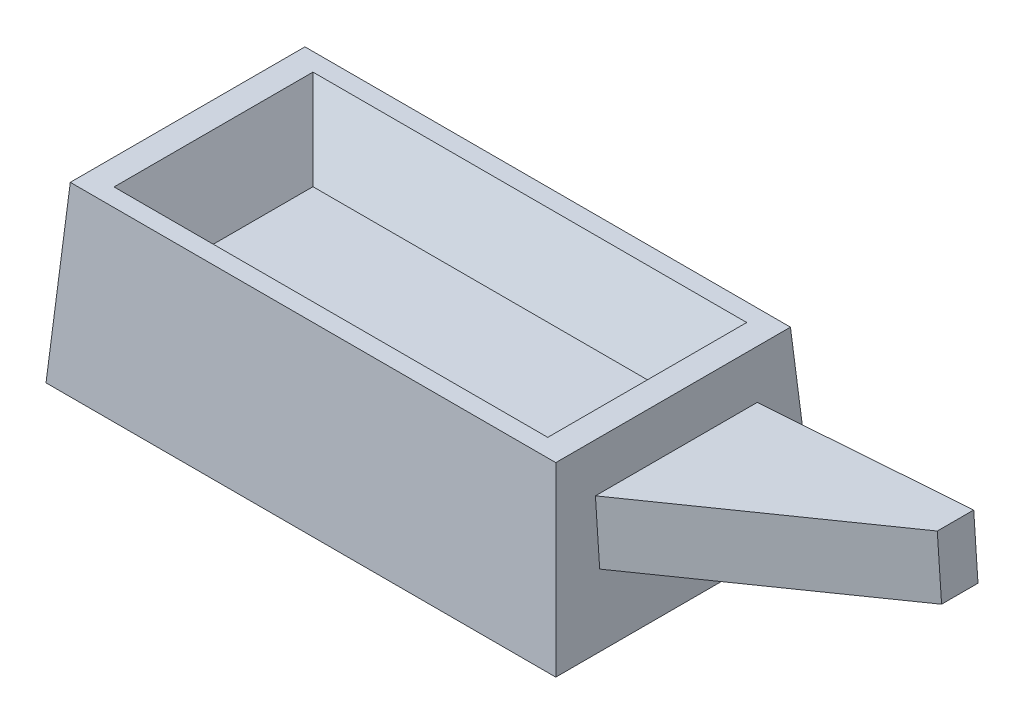
ISO-10303-21;
HEADER;
FILE_DESCRIPTION(('STEP AP214'),'2;1');
FILE_NAME('part.step','',(''),(''),'','','');
FILE_SCHEMA(('AUTOMOTIVE_DESIGN { 1 0 10303 214 1 1 1 1 }'));
ENDSEC;
DATA;
#1=APPLICATION_CONTEXT('core data for automotive mechanical design processes');
#2=APPLICATION_PROTOCOL_DEFINITION('international standard','automotive_design',2000,#1);
#3=PRODUCT_CONTEXT('',#1,'mechanical');
#4=PRODUCT('Part','Part','',(#3));
#5=PRODUCT_RELATED_PRODUCT_CATEGORY('part','',(#4));
#6=PRODUCT_DEFINITION_FORMATION('','',#4);
#7=PRODUCT_DEFINITION_CONTEXT('part definition',#1,'design');
#8=PRODUCT_DEFINITION('design','',#6,#7);
#9=PRODUCT_DEFINITION_SHAPE('','',#8);
#10=(LENGTH_UNIT() NAMED_UNIT(*) SI_UNIT(.MILLI.,.METRE.));
#11=(NAMED_UNIT(*) PLANE_ANGLE_UNIT() SI_UNIT($,.RADIAN.));
#12=(NAMED_UNIT(*) SI_UNIT($,.STERADIAN.) SOLID_ANGLE_UNIT());
#13=UNCERTAINTY_MEASURE_WITH_UNIT(LENGTH_MEASURE(1.E-05),#10,'distance_accuracy_value','');
#14=(GEOMETRIC_REPRESENTATION_CONTEXT(3) GLOBAL_UNCERTAINTY_ASSIGNED_CONTEXT((#13)) GLOBAL_UNIT_ASSIGNED_CONTEXT((#10,
#11,#12)) REPRESENTATION_CONTEXT('',''));
#15=CARTESIAN_POINT('',(0.,0.,0.));
#16=DIRECTION('',(0.,0.,1.));
#17=DIRECTION('',(1.,0.,0.));
#18=AXIS2_PLACEMENT_3D('',#15,#16,#17);
#19=CARTESIAN_POINT('',(102.892841401862,0.,52.2673742227546));
#20=DIRECTION('',(0.997564050259824,0.0697564737441253,0.));
#21=DIRECTION('',(-0.0697564737441253,0.997564050259824,0.));
#22=AXIS2_PLACEMENT_3D('',#19,#20,#21);
#23=PLANE('',#22);
#24=DIRECTION('',(0.,0.,-1.));
#25=VECTOR('',#24,1.);
#26=CARTESIAN_POINT('',(102.892841401862,0.,52.2673742227546));
#27=LINE('',#26,#25);
#28=CARTESIAN_POINT('',(102.892841401862,0.,52.2673742227546));
#29=VERTEX_POINT('',#28);
#30=CARTESIAN_POINT('',(102.892841401862,0.,-52.2673742227546));
#31=VERTEX_POINT('',#30);
#32=EDGE_CURVE('E168',#29,#31,#27,.T.);
#33=ORIENTED_EDGE('',*,*,#32,.T.);
#34=DIRECTION('',(0.0695873743166647,-0.995145815783508,-0.0695873743166647));
#35=VECTOR('',#34,1.);
#36=CARTESIAN_POINT('',(101.896344263182,14.2505730060454,-51.2708770840736));
#37=LINE('',#36,#35);
#38=CARTESIAN_POINT('',(97.9906921773746,70.104,-47.3652249982668));
#39=VERTEX_POINT('',#38);
#40=EDGE_CURVE('E11',#39,#31,#37,.T.);
#41=ORIENTED_EDGE('',*,*,#40,.F.);
#42=DIRECTION('',(0.,0.,1.));
#43=VECTOR('',#42,1.);
#44=CARTESIAN_POINT('',(97.9906921773746,70.104,0.));
#45=LINE('',#44,#43);
#46=CARTESIAN_POINT('',(97.9906921773746,70.104,47.3652249982668));
#47=VERTEX_POINT('',#46);
#48=EDGE_CURVE('E177',#47,#39,#45,.F.);
#49=ORIENTED_EDGE('',*,*,#48,.F.);
#50=DIRECTION('',(0.0695873743166647,-0.995145815783508,0.0695873743166647));
#51=VECTOR('',#50,1.);
#52=CARTESIAN_POINT('',(102.892841401862,0.,52.2673742227546));
#53=LINE('',#52,#51);
#54=EDGE_CURVE('E179',#47,#29,#53,.T.);
#55=ORIENTED_EDGE('',*,*,#54,.T.);
#56=EDGE_LOOP('',(#33,#41,#49,#55));
#57=FACE_BOUND('',#56,.T.);
#58=DIRECTION('',(-0.0697564737441254,0.997564050259824,0.));
#59=VECTOR('',#58,1.);
#60=CARTESIAN_POINT('',(101.00248426626,27.0333665022499,-32.6490823699169));
#61=LINE('',#60,#59);
#62=CARTESIAN_POINT('',(101.00248426626,27.0333665022499,-32.6490823699169));
#63=VERTEX_POINT('',#62);
#64=CARTESIAN_POINT('',(99.2725480333353,51.7726072146952,-32.6490823699169));
#65=VERTEX_POINT('',#64);
#66=EDGE_CURVE('E127',#63,#65,#61,.T.);
#67=ORIENTED_EDGE('',*,*,#66,.F.);
#68=DIRECTION('',(0.,0.,-1.));
#69=VECTOR('',#68,1.);
#70=CARTESIAN_POINT('',(101.00248426626,27.0333665022499,32.6490823699169));
#71=LINE('',#70,#69);
#72=CARTESIAN_POINT('',(101.00248426626,27.0333665022499,32.6490823699169));
#73=VERTEX_POINT('',#72);
#74=EDGE_CURVE('E123',#73,#63,#71,.T.);
#75=ORIENTED_EDGE('',*,*,#74,.F.);
#76=DIRECTION('',(0.0697564737441254,-0.997564050259824,0.));
#77=VECTOR('',#76,1.);
#78=CARTESIAN_POINT('',(101.00248426626,27.0333665022499,32.6490823699169));
#79=LINE('',#78,#77);
#80=CARTESIAN_POINT('',(99.2725480333353,51.7726072146946,32.6490823699169));
#81=VERTEX_POINT('',#80);
#82=EDGE_CURVE('E125',#81,#73,#79,.T.);
#83=ORIENTED_EDGE('',*,*,#82,.F.);
#84=DIRECTION('',(0.,0.,1.));
#85=VECTOR('',#84,1.);
#86=CARTESIAN_POINT('',(99.2725480333353,51.7726072146952,32.6490823699169));
#87=LINE('',#86,#85);
#88=EDGE_CURVE('E52',#65,#81,#87,.T.);
#89=ORIENTED_EDGE('',*,*,#88,.F.);
#90=EDGE_LOOP('',(#67,#75,#83,#89));
#91=FACE_BOUND('',#90,.T.);
#92=ADVANCED_FACE('F33',(#57,#91),#23,.T.);
#93=CARTESIAN_POINT('',(-102.892841401862,0.,-52.2673742227546));
#94=DIRECTION('',(0.,0.0697564737441253,-0.997564050259824));
#95=DIRECTION('',(0.,0.997564050259824,0.0697564737441253));
#96=AXIS2_PLACEMENT_3D('',#93,#94,#95);
#97=PLANE('',#96);
#98=DIRECTION('',(-1.,0.,0.));
#99=VECTOR('',#98,1.);
#100=CARTESIAN_POINT('',(-102.892841401862,0.,-52.2673742227546));
#101=LINE('',#100,#99);
#102=CARTESIAN_POINT('',(-102.892841401862,0.,-52.2673742227546));
#103=VERTEX_POINT('',#102);
#104=EDGE_CURVE('E171',#31,#103,#101,.T.);
#105=ORIENTED_EDGE('',*,*,#104,.T.);
#106=DIRECTION('',(-0.0695873743166647,-0.995145815783508,-0.0695873743166647));
#107=VECTOR('',#106,1.);
#108=CARTESIAN_POINT('',(-102.386642057479,7.23898788339008,-51.7611748783715));
#109=LINE('',#108,#107);
#110=CARTESIAN_POINT('',(-97.9906921773746,70.104,-47.3652249982668));
#111=VERTEX_POINT('',#110);
#112=EDGE_CURVE('E43',#111,#103,#109,.T.);
#113=ORIENTED_EDGE('',*,*,#112,.F.);
#114=DIRECTION('',(1.,0.,0.));
#115=VECTOR('',#114,1.);
#116=CARTESIAN_POINT('',(0.,70.104,-47.3652249982668));
#117=LINE('',#116,#115);
#118=EDGE_CURVE('E190',#39,#111,#117,.F.);
#119=ORIENTED_EDGE('',*,*,#118,.F.);
#120=ORIENTED_EDGE('',*,*,#40,.T.);
#121=EDGE_LOOP('',(#105,#113,#119,#120));
#122=FACE_BOUND('',#121,.T.);
#123=ADVANCED_FACE('F229',(#122),#97,.T.);
#124=CARTESIAN_POINT('',(-102.892841401862,0.,52.2673742227546));
#125=DIRECTION('',(-0.997564050259824,0.0697564737441253,0.));
#126=DIRECTION('',(-0.0697564737441253,-0.997564050259824,0.));
#127=AXIS2_PLACEMENT_3D('',#124,#125,#126);
#128=PLANE('',#127);
#129=DIRECTION('',(0.,0.,1.));
#130=VECTOR('',#129,1.);
#131=CARTESIAN_POINT('',(-102.892841401862,0.,52.2673742227546));
#132=LINE('',#131,#130);
#133=CARTESIAN_POINT('',(-102.892841401862,0.,52.2673742227546));
#134=VERTEX_POINT('',#133);
#135=EDGE_CURVE('E174',#103,#134,#132,.T.);
#136=ORIENTED_EDGE('',*,*,#135,.T.);
#137=DIRECTION('',(-0.0695873743166647,-0.995145815783508,0.0695873743166647));
#138=VECTOR('',#137,1.);
#139=CARTESIAN_POINT('',(-102.892841401862,0.,52.2673742227546));
#140=LINE('',#139,#138);
#141=CARTESIAN_POINT('',(-97.9906921773746,70.104,47.3652249982668));
#142=VERTEX_POINT('',#141);
#143=EDGE_CURVE('E182',#142,#134,#140,.T.);
#144=ORIENTED_EDGE('',*,*,#143,.F.);
#145=DIRECTION('',(0.,0.,-1.));
#146=VECTOR('',#145,1.);
#147=CARTESIAN_POINT('',(-97.9906921773746,70.104,0.));
#148=LINE('',#147,#146);
#149=EDGE_CURVE('E192',#111,#142,#148,.F.);
#150=ORIENTED_EDGE('',*,*,#149,.F.);
#151=ORIENTED_EDGE('',*,*,#112,.T.);
#152=EDGE_LOOP('',(#136,#144,#150,#151));
#153=FACE_BOUND('',#152,.T.);
#154=ADVANCED_FACE('F235',(#153),#128,.T.);
#155=CARTESIAN_POINT('',(-102.892841401862,0.,52.2673742227546));
#156=DIRECTION('',(0.,0.0697564737441253,0.997564050259824));
#157=DIRECTION('',(0.,-0.997564050259824,0.0697564737441253));
#158=AXIS2_PLACEMENT_3D('',#155,#156,#157);
#159=PLANE('',#158);
#160=DIRECTION('',(1.,0.,0.));
#161=VECTOR('',#160,1.);
#162=CARTESIAN_POINT('',(-102.892841401862,0.,52.2673742227546));
#163=LINE('',#162,#161);
#164=EDGE_CURVE('E176',#134,#29,#163,.T.);
#165=ORIENTED_EDGE('',*,*,#164,.T.);
#166=ORIENTED_EDGE('',*,*,#54,.F.);
#167=DIRECTION('',(-1.,0.,0.));
#168=VECTOR('',#167,1.);
#169=CARTESIAN_POINT('',(0.,70.104,47.3652249982668));
#170=LINE('',#169,#168);
#171=EDGE_CURVE('E183',#142,#47,#170,.F.);
#172=ORIENTED_EDGE('',*,*,#171,.F.);
#173=ORIENTED_EDGE('',*,*,#143,.T.);
#174=EDGE_LOOP('',(#165,#166,#172,#173));
#175=FACE_BOUND('',#174,.T.);
#176=ADVANCED_FACE('F242',(#175),#159,.T.);
#177=CARTESIAN_POINT('',(0.,70.104,0.));
#178=DIRECTION('',(0.,-1.,0.));
#179=DIRECTION('',(0.,0.,-1.));
#180=AXIS2_PLACEMENT_3D('',#177,#178,#179);
#181=PLANE('',#180);
#182=DIRECTION('',(1.,0.,0.));
#183=VECTOR('',#182,1.);
#184=CARTESIAN_POINT('',(-72.8794328331901,70.104,-40.1517457005861));
#185=LINE('',#184,#183);
#186=CARTESIAN_POINT('',(87.5441296706066,70.104,-40.1517457005861));
#187=VERTEX_POINT('',#186);
#188=CARTESIAN_POINT('',(-87.5441296706066,70.104,-40.1517457005861));
#189=VERTEX_POINT('',#188);
#190=EDGE_CURVE('E207',#187,#189,#185,.F.);
#191=ORIENTED_EDGE('',*,*,#190,.F.);
#192=DIRECTION('',(0.,0.,1.));
#193=VECTOR('',#192,1.);
#194=CARTESIAN_POINT('',(87.5441296706066,70.104,25.4870488631695));
#195=LINE('',#194,#193);
#196=CARTESIAN_POINT('',(87.5441296706066,70.104,40.1517457005861));
#197=VERTEX_POINT('',#196);
#198=EDGE_CURVE('E153',#197,#187,#195,.F.);
#199=ORIENTED_EDGE('',*,*,#198,.F.);
#200=DIRECTION('',(-1.,0.,0.));
#201=VECTOR('',#200,1.);
#202=CARTESIAN_POINT('',(-72.8794328331901,70.104,40.1517457005861));
#203=LINE('',#202,#201);
#204=CARTESIAN_POINT('',(-87.5441296706066,70.104,40.1517457005861));
#205=VERTEX_POINT('',#204);
#206=EDGE_CURVE('E158',#205,#197,#203,.F.);
#207=ORIENTED_EDGE('',*,*,#206,.F.);
#208=DIRECTION('',(0.,0.,-1.));
#209=VECTOR('',#208,1.);
#210=CARTESIAN_POINT('',(-87.5441296706066,70.104,25.4870488631695));
#211=LINE('',#210,#209);
#212=EDGE_CURVE('E204',#189,#205,#211,.F.);
#213=ORIENTED_EDGE('',*,*,#212,.F.);
#214=EDGE_LOOP('',(#191,#199,#207,#213));
#215=FACE_BOUND('',#214,.T.);
#216=ORIENTED_EDGE('',*,*,#48,.T.);
#217=ORIENTED_EDGE('',*,*,#118,.T.);
#218=ORIENTED_EDGE('',*,*,#149,.T.);
#219=ORIENTED_EDGE('',*,*,#171,.T.);
#220=EDGE_LOOP('',(#216,#217,#218,#219));
#221=FACE_BOUND('',#220,.T.);
#222=ADVANCED_FACE('F245',(#215,#221),#181,.F.);
#223=CARTESIAN_POINT('',(0.,0.,0.));
#224=DIRECTION('',(0.,-1.,0.));
#225=DIRECTION('',(0.,0.,-1.));
#226=AXIS2_PLACEMENT_3D('',#223,#224,#225);
#227=PLANE('',#226);
#228=ORIENTED_EDGE('',*,*,#32,.F.);
#229=ORIENTED_EDGE('',*,*,#164,.F.);
#230=ORIENTED_EDGE('',*,*,#135,.F.);
#231=ORIENTED_EDGE('',*,*,#104,.F.);
#232=EDGE_LOOP('',(#228,#229,#230,#231));
#233=FACE_BOUND('',#232,.T.);
#234=ADVANCED_FACE('F240',(#233),#227,.T.);
#235=CARTESIAN_POINT('',(72.8794328331901,44.704,25.4870488631695));
#236=DIRECTION('',(-0.866025403784438,0.500000000000001,0.));
#237=DIRECTION('',(-0.500000000000001,-0.866025403784438,0.));
#238=AXIS2_PLACEMENT_3D('',#235,#236,#237);
#239=PLANE('',#238);
#240=ORIENTED_EDGE('',*,*,#198,.T.);
#241=DIRECTION('',(0.447213595499959,0.774596669241482,-0.447213595499959));
#242=VECTOR('',#241,1.);
#243=CARTESIAN_POINT('',(62.6846132879222,27.0460545735999,-15.2922293179017));
#244=LINE('',#243,#242);
#245=CARTESIAN_POINT('',(72.8794328331901,44.704,-25.4870488631695));
#246=VERTEX_POINT('',#245);
#247=EDGE_CURVE('E167',#246,#187,#244,.T.);
#248=ORIENTED_EDGE('',*,*,#247,.F.);
#249=DIRECTION('',(0.,0.,-1.));
#250=VECTOR('',#249,1.);
#251=CARTESIAN_POINT('',(72.8794328331901,44.704,25.4870488631695));
#252=LINE('',#251,#250);
#253=CARTESIAN_POINT('',(72.8794328331901,44.704,25.4870488631695));
#254=VERTEX_POINT('',#253);
#255=EDGE_CURVE('E154',#254,#246,#252,.T.);
#256=ORIENTED_EDGE('',*,*,#255,.F.);
#257=DIRECTION('',(0.447213595499959,0.774596669241482,0.447213595499959));
#258=VECTOR('',#257,1.);
#259=CARTESIAN_POINT('',(43.727659699914,-5.78835219755546,-3.66472427010659));
#260=LINE('',#259,#258);
#261=EDGE_CURVE('E172',#254,#197,#260,.T.);
#262=ORIENTED_EDGE('',*,*,#261,.T.);
#263=EDGE_LOOP('',(#240,#248,#256,#262));
#264=FACE_BOUND('',#263,.T.);
#265=ADVANCED_FACE('F254',(#264),#239,.T.);
#266=CARTESIAN_POINT('',(-72.8794328331901,44.704,25.4870488631695));
#267=DIRECTION('',(0.,0.500000000000001,-0.866025403784438));
#268=DIRECTION('',(0.,0.866025403784438,0.500000000000001));
#269=AXIS2_PLACEMENT_3D('',#266,#267,#268);
#270=PLANE('',#269);
#271=ORIENTED_EDGE('',*,*,#206,.T.);
#272=ORIENTED_EDGE('',*,*,#261,.F.);
#273=DIRECTION('',(1.,0.,0.));
#274=VECTOR('',#273,1.);
#275=CARTESIAN_POINT('',(-72.8794328331901,44.704,25.4870488631695));
#276=LINE('',#275,#274);
#277=CARTESIAN_POINT('',(-72.8794328331901,44.704,25.4870488631695));
#278=VERTEX_POINT('',#277);
#279=EDGE_CURVE('E164',#278,#254,#276,.T.);
#280=ORIENTED_EDGE('',*,*,#279,.F.);
#281=DIRECTION('',(-0.447213595499959,0.774596669241482,0.447213595499959));
#282=VECTOR('',#281,1.);
#283=CARTESIAN_POINT('',(-72.8794328331901,44.704,25.4870488631695));
#284=LINE('',#283,#282);
#285=EDGE_CURVE('E196',#278,#205,#284,.T.);
#286=ORIENTED_EDGE('',*,*,#285,.T.);
#287=EDGE_LOOP('',(#271,#272,#280,#286));
#288=FACE_BOUND('',#287,.T.);
#289=ADVANCED_FACE('F250',(#288),#270,.T.);
#290=CARTESIAN_POINT('',(-72.8794328331901,44.704,25.4870488631695));
#291=DIRECTION('',(0.866025403784438,0.500000000000001,0.));
#292=DIRECTION('',(-0.500000000000001,0.866025403784438,0.));
#293=AXIS2_PLACEMENT_3D('',#290,#291,#292);
#294=PLANE('',#293);
#295=ORIENTED_EDGE('',*,*,#212,.T.);
#296=ORIENTED_EDGE('',*,*,#285,.F.);
#297=DIRECTION('',(0.,0.,1.));
#298=VECTOR('',#297,1.);
#299=CARTESIAN_POINT('',(-72.8794328331901,44.704,25.4870488631695));
#300=LINE('',#299,#298);
#301=CARTESIAN_POINT('',(-72.8794328331901,44.704,-25.4870488631695));
#302=VERTEX_POINT('',#301);
#303=EDGE_CURVE('E161',#302,#278,#300,.T.);
#304=ORIENTED_EDGE('',*,*,#303,.F.);
#305=DIRECTION('',(-0.447213595499959,0.774596669241482,-0.447213595499959));
#306=VECTOR('',#305,1.);
#307=CARTESIAN_POINT('',(-72.8794328331901,44.704,-25.4870488631695));
#308=LINE('',#307,#306);
#309=EDGE_CURVE('E198',#302,#189,#308,.T.);
#310=ORIENTED_EDGE('',*,*,#309,.T.);
#311=EDGE_LOOP('',(#295,#296,#304,#310));
#312=FACE_BOUND('',#311,.T.);
#313=ADVANCED_FACE('F253',(#312),#294,.T.);
#314=CARTESIAN_POINT('',(-72.8794328331901,44.704,-25.4870488631695));
#315=DIRECTION('',(0.,0.500000000000001,0.866025403784438));
#316=DIRECTION('',(0.,-0.866025403784438,0.500000000000001));
#317=AXIS2_PLACEMENT_3D('',#314,#315,#316);
#318=PLANE('',#317);
#319=ORIENTED_EDGE('',*,*,#190,.T.);
#320=ORIENTED_EDGE('',*,*,#309,.F.);
#321=DIRECTION('',(-1.,0.,0.));
#322=VECTOR('',#321,1.);
#323=CARTESIAN_POINT('',(-72.8794328331901,44.704,-25.4870488631695));
#324=LINE('',#323,#322);
#325=EDGE_CURVE('E157',#246,#302,#324,.T.);
#326=ORIENTED_EDGE('',*,*,#325,.F.);
#327=ORIENTED_EDGE('',*,*,#247,.T.);
#328=EDGE_LOOP('',(#319,#320,#326,#327));
#329=FACE_BOUND('',#328,.T.);
#330=ADVANCED_FACE('F225',(#329),#318,.T.);
#331=CARTESIAN_POINT('',(0.,44.704,0.));
#332=DIRECTION('',(0.,-1.,0.));
#333=DIRECTION('',(0.,0.,-1.));
#334=AXIS2_PLACEMENT_3D('',#331,#332,#333);
#335=PLANE('',#334);
#336=ORIENTED_EDGE('',*,*,#255,.T.);
#337=ORIENTED_EDGE('',*,*,#325,.T.);
#338=ORIENTED_EDGE('',*,*,#303,.T.);
#339=ORIENTED_EDGE('',*,*,#279,.T.);
#340=EDGE_LOOP('',(#336,#337,#338,#339));
#341=FACE_BOUND('',#340,.T.);
#342=ADVANCED_FACE('F218',(#341),#335,.F.);
#343=CARTESIAN_POINT('',(188.419021990528,33.1461262964476,-32.6490823699169));
#344=DIRECTION('',(0.,0.,1.));
#345=DIRECTION('',(1.,0.,0.));
#346=AXIS2_PLACEMENT_3D('',#343,#344,#345);
#347=PLANE('',#346);
#348=ORIENTED_EDGE('',*,*,#66,.T.);
#349=DIRECTION('',(-0.997564050259824,-0.0697564737441253,0.));
#350=VECTOR('',#349,1.);
#351=CARTESIAN_POINT('',(186.689085757604,57.8853670088929,-32.6490823699169));
#352=LINE('',#351,#350);
#353=CARTESIAN_POINT('',(186.689085757604,57.8853670088929,-32.6490823699169));
#354=VERTEX_POINT('',#353);
#355=EDGE_CURVE('E144',#354,#65,#352,.T.);
#356=ORIENTED_EDGE('',*,*,#355,.F.);
#357=DIRECTION('',(-0.0697564737441254,0.997564050259824,0.));
#358=VECTOR('',#357,1.);
#359=CARTESIAN_POINT('',(188.419021990528,33.1461262964476,-32.6490823699169));
#360=LINE('',#359,#358);
#361=CARTESIAN_POINT('',(188.419021990528,33.1461262964476,-32.6490823699169));
#362=VERTEX_POINT('',#361);
#363=EDGE_CURVE('E132',#362,#354,#360,.T.);
#364=ORIENTED_EDGE('',*,*,#363,.F.);
#365=DIRECTION('',(-0.997564050259824,-0.0697564737441253,0.));
#366=VECTOR('',#365,1.);
#367=CARTESIAN_POINT('',(188.419021990528,33.1461262964476,-32.6490823699169));
#368=LINE('',#367,#366);
#369=EDGE_CURVE('E143',#362,#63,#368,.T.);
#370=ORIENTED_EDGE('',*,*,#369,.T.);
#371=EDGE_LOOP('',(#348,#356,#364,#370));
#372=FACE_BOUND('',#371,.T.);
#373=ADVANCED_FACE('F216',(#372),#347,.F.);
#374=CARTESIAN_POINT('',(186.689085757604,57.8853670088929,32.6490823699169));
#375=DIRECTION('',(0.0697564737441253,-0.997564050259824,0.));
#376=DIRECTION('',(0.997564050259824,0.0697564737441253,0.));
#377=AXIS2_PLACEMENT_3D('',#374,#375,#376);
#378=PLANE('',#377);
#379=ORIENTED_EDGE('',*,*,#88,.T.);
#380=DIRECTION('',(0.863915809427104,0.0604108783408347,-0.500000000000001));
#381=VECTOR('',#380,1.);
#382=CARTESIAN_POINT('',(99.2725480333353,51.7726072146952,32.6490823699169));
#383=LINE('',#382,#381);
#384=CARTESIAN_POINT('',(186.689085757604,57.8853670088929,-17.9441217191701));
#385=VERTEX_POINT('',#384);
#386=EDGE_CURVE('E139',#385,#81,#383,.F.);
#387=ORIENTED_EDGE('',*,*,#386,.F.);
#388=DIRECTION('',(0.,0.,1.));
#389=VECTOR('',#388,1.);
#390=CARTESIAN_POINT('',(186.689085757604,57.8853670088929,32.6490823699169));
#391=LINE('',#390,#389);
#392=EDGE_CURVE('E79',#354,#385,#391,.T.);
#393=ORIENTED_EDGE('',*,*,#392,.F.);
#394=ORIENTED_EDGE('',*,*,#355,.T.);
#395=EDGE_LOOP('',(#379,#387,#393,#394));
#396=FACE_BOUND('',#395,.T.);
#397=ADVANCED_FACE('F214',(#396),#378,.F.);
#398=CARTESIAN_POINT('',(101.00248426626,27.0333665022499,32.6490823699169));
#399=DIRECTION('',(0.498782025129913,0.0348782368720628,0.866025403784438));
#400=DIRECTION('',(0.866552641099085,0.,-0.499085684230875));
#401=AXIS2_PLACEMENT_3D('',#398,#399,#400);
#402=PLANE('',#401);
#403=ORIENTED_EDGE('',*,*,#82,.T.);
#404=DIRECTION('',(0.863915809427104,0.0604108783408347,-0.500000000000001));
#405=VECTOR('',#404,1.);
#406=CARTESIAN_POINT('',(166.564887559461,31.6179363478982,-5.29582069689834));
#407=LINE('',#406,#405);
#408=CARTESIAN_POINT('',(188.419021990528,33.1461262964476,-17.9441217191701));
#409=VERTEX_POINT('',#408);
#410=EDGE_CURVE('E37',#409,#73,#407,.F.);
#411=ORIENTED_EDGE('',*,*,#410,.F.);
#412=DIRECTION('',(-0.0697564737441254,0.997564050259824,0.));
#413=VECTOR('',#412,1.);
#414=CARTESIAN_POINT('',(189.808706096377,13.2727176964424,-17.9441217191702));
#415=LINE('',#414,#413);
#416=EDGE_CURVE('E149',#385,#409,#415,.F.);
#417=ORIENTED_EDGE('',*,*,#416,.F.);
#418=ORIENTED_EDGE('',*,*,#386,.T.);
#419=EDGE_LOOP('',(#403,#411,#417,#418));
#420=FACE_BOUND('',#419,.T.);
#421=ADVANCED_FACE('F35',(#420),#402,.T.);
#422=CARTESIAN_POINT('',(188.419021990528,33.1461262964476,32.6490823699169));
#423=DIRECTION('',(-0.0697564737441253,0.997564050259824,0.));
#424=DIRECTION('',(-0.997564050259824,-0.0697564737441253,0.));
#425=AXIS2_PLACEMENT_3D('',#422,#423,#424);
#426=PLANE('',#425);
#427=ORIENTED_EDGE('',*,*,#74,.T.);
#428=ORIENTED_EDGE('',*,*,#369,.F.);
#429=DIRECTION('',(0.,0.,-1.));
#430=VECTOR('',#429,1.);
#431=CARTESIAN_POINT('',(188.419021990528,33.1461262964476,32.6490823699169));
#432=LINE('',#431,#430);
#433=EDGE_CURVE('E142',#409,#362,#432,.T.);
#434=ORIENTED_EDGE('',*,*,#433,.F.);
#435=ORIENTED_EDGE('',*,*,#410,.T.);
#436=EDGE_LOOP('',(#427,#428,#434,#435));
#437=FACE_BOUND('',#436,.T.);
#438=ADVANCED_FACE('F141',(#437),#426,.F.);
#439=CARTESIAN_POINT('',(189.808706096377,13.2727176964424,0.));
#440=DIRECTION('',(-0.997564050259824,-0.0697564737441254,0.));
#441=DIRECTION('',(0.0697564737441254,-0.997564050259824,0.));
#442=AXIS2_PLACEMENT_3D('',#439,#440,#441);
#443=PLANE('',#442);
#444=ORIENTED_EDGE('',*,*,#363,.T.);
#445=ORIENTED_EDGE('',*,*,#392,.T.);
#446=ORIENTED_EDGE('',*,*,#416,.T.);
#447=ORIENTED_EDGE('',*,*,#433,.T.);
#448=EDGE_LOOP('',(#444,#445,#446,#447));
#449=FACE_BOUND('',#448,.T.);
#450=ADVANCED_FACE('F336',(#449),#443,.F.);
#451=CLOSED_SHELL('',(#92,#123,#154,#176,#222,#234,#265,#289,#313,#330,#342,#373,#397,#421,#438,#450));
#452=MANIFOLD_SOLID_BREP('B2',#451);
#453=ADVANCED_BREP_SHAPE_REPRESENTATION('',(#18,#452),#14);
#454=SHAPE_DEFINITION_REPRESENTATION(#9,#453);
ENDSEC;
END-ISO-10303-21;
